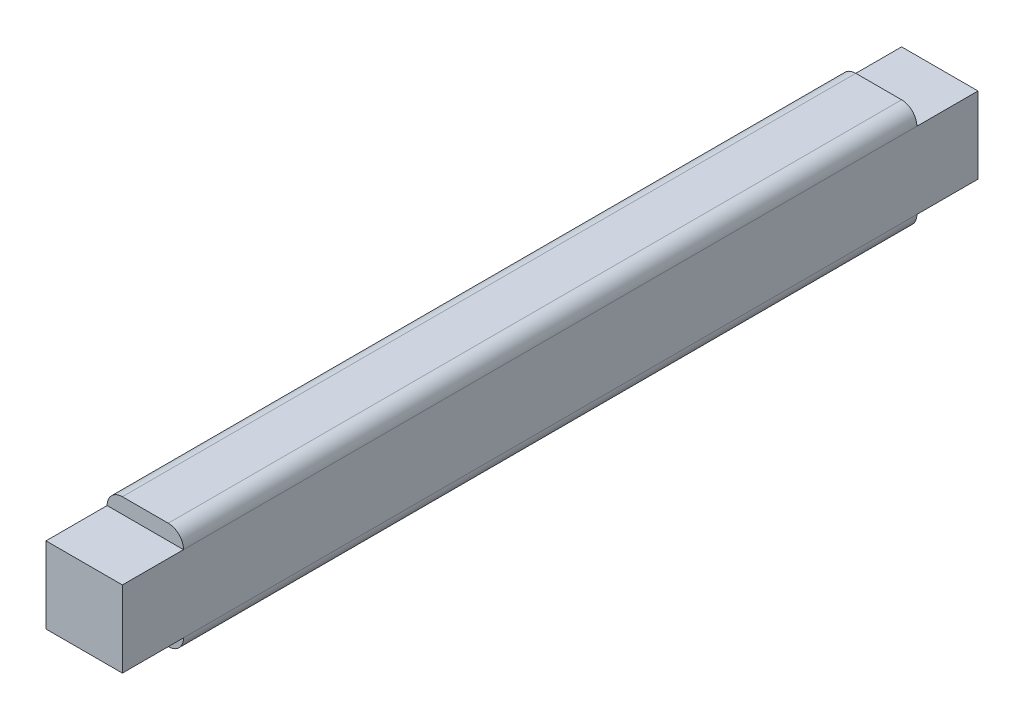
ISO-10303-21;
HEADER;
FILE_DESCRIPTION(('STEP AP214'),'2;1');
FILE_NAME('part.step','',(''),(''),'','','');
FILE_SCHEMA(('AUTOMOTIVE_DESIGN { 1 0 10303 214 1 1 1 1 }'));
ENDSEC;
DATA;
#1=APPLICATION_CONTEXT('core data for automotive mechanical design processes');
#2=APPLICATION_PROTOCOL_DEFINITION('international standard','automotive_design',2000,#1);
#3=PRODUCT_CONTEXT('',#1,'mechanical');
#4=PRODUCT('Part','Part','',(#3));
#5=PRODUCT_RELATED_PRODUCT_CATEGORY('part','',(#4));
#6=PRODUCT_DEFINITION_FORMATION('','',#4);
#7=PRODUCT_DEFINITION_CONTEXT('part definition',#1,'design');
#8=PRODUCT_DEFINITION('design','',#6,#7);
#9=PRODUCT_DEFINITION_SHAPE('','',#8);
#10=(LENGTH_UNIT() NAMED_UNIT(*) SI_UNIT(.MILLI.,.METRE.));
#11=(NAMED_UNIT(*) PLANE_ANGLE_UNIT() SI_UNIT($,.RADIAN.));
#12=(NAMED_UNIT(*) SI_UNIT($,.STERADIAN.) SOLID_ANGLE_UNIT());
#13=UNCERTAINTY_MEASURE_WITH_UNIT(LENGTH_MEASURE(1.E-05),#10,'distance_accuracy_value','');
#14=(GEOMETRIC_REPRESENTATION_CONTEXT(3) GLOBAL_UNCERTAINTY_ASSIGNED_CONTEXT((#13)) GLOBAL_UNIT_ASSIGNED_CONTEXT((#10,
#11,#12)) REPRESENTATION_CONTEXT('',''));
#15=CARTESIAN_POINT('',(0.,0.,0.));
#16=DIRECTION('',(0.,0.,1.));
#17=DIRECTION('',(1.,0.,0.));
#18=AXIS2_PLACEMENT_3D('',#15,#16,#17);
#19=CARTESIAN_POINT('',(0.,0.,0.));
#20=DIRECTION('',(0.,0.,-1.));
#21=DIRECTION('',(-1.,0.,0.));
#22=AXIS2_PLACEMENT_3D('',#19,#20,#21);
#23=PLANE('',#22);
#24=DIRECTION('',(0.,1.,0.));
#25=VECTOR('',#24,1.);
#26=CARTESIAN_POINT('',(25.,0.,0.));
#27=LINE('',#26,#25);
#28=CARTESIAN_POINT('',(25.,5.,0.));
#29=VERTEX_POINT('',#28);
#30=CARTESIAN_POINT('',(25.,30.,0.));
#31=VERTEX_POINT('',#30);
#32=EDGE_CURVE('E204',#29,#31,#27,.T.);
#33=ORIENTED_EDGE('',*,*,#32,.F.);
#34=DIRECTION('',(-1.,0.,0.));
#35=VECTOR('',#34,1.);
#36=CARTESIAN_POINT('',(0.,5.,0.));
#37=LINE('',#36,#35);
#38=CARTESIAN_POINT('',(0.,5.,0.));
#39=VERTEX_POINT('',#38);
#40=EDGE_CURVE('E158',#29,#39,#37,.T.);
#41=ORIENTED_EDGE('',*,*,#40,.T.);
#42=DIRECTION('',(0.,-1.,0.));
#43=VECTOR('',#42,1.);
#44=CARTESIAN_POINT('',(0.,0.,0.));
#45=LINE('',#44,#43);
#46=CARTESIAN_POINT('',(0.,30.,0.));
#47=VERTEX_POINT('',#46);
#48=EDGE_CURVE('E199',#47,#39,#45,.T.);
#49=ORIENTED_EDGE('',*,*,#48,.F.);
#50=DIRECTION('',(1.,0.,0.));
#51=VECTOR('',#50,1.);
#52=CARTESIAN_POINT('',(0.,30.,0.));
#53=LINE('',#52,#51);
#54=EDGE_CURVE('E153',#47,#31,#53,.T.);
#55=ORIENTED_EDGE('',*,*,#54,.T.);
#56=EDGE_LOOP('',(#33,#41,#49,#55));
#57=FACE_BOUND('',#56,.T.);
#58=ADVANCED_FACE('F35',(#57),#23,.T.);
#59=CARTESIAN_POINT('',(0.,0.,280.));
#60=DIRECTION('',(1.,0.,0.));
#61=DIRECTION('',(0.,0.,-1.));
#62=AXIS2_PLACEMENT_3D('',#59,#60,#61);
#63=PLANE('',#62);
#64=DIRECTION('',(0.,0.,-1.));
#65=VECTOR('',#64,1.);
#66=CARTESIAN_POINT('',(0.,5.,20.));
#67=LINE('',#66,#65);
#68=CARTESIAN_POINT('',(0.,5.,20.));
#69=VERTEX_POINT('',#68);
#70=EDGE_CURVE('E166',#69,#39,#67,.T.);
#71=ORIENTED_EDGE('',*,*,#70,.F.);
#72=DIRECTION('',(0.,0.,-1.));
#73=VECTOR('',#72,1.);
#74=CARTESIAN_POINT('',(0.,5.,280.));
#75=LINE('',#74,#73);
#76=CARTESIAN_POINT('',(0.,5.,260.));
#77=VERTEX_POINT('',#76);
#78=EDGE_CURVE('E144',#69,#77,#75,.F.);
#79=ORIENTED_EDGE('',*,*,#78,.T.);
#80=DIRECTION('',(0.,0.,1.));
#81=VECTOR('',#80,1.);
#82=CARTESIAN_POINT('',(0.,5.,260.));
#83=LINE('',#82,#81);
#84=CARTESIAN_POINT('',(0.,5.,280.));
#85=VERTEX_POINT('',#84);
#86=EDGE_CURVE('E191',#77,#85,#83,.T.);
#87=ORIENTED_EDGE('',*,*,#86,.T.);
#88=DIRECTION('',(0.,-1.,0.));
#89=VECTOR('',#88,1.);
#90=CARTESIAN_POINT('',(0.,0.,280.));
#91=LINE('',#90,#89);
#92=CARTESIAN_POINT('',(0.,30.,280.));
#93=VERTEX_POINT('',#92);
#94=EDGE_CURVE('E200',#93,#85,#91,.T.);
#95=ORIENTED_EDGE('',*,*,#94,.F.);
#96=DIRECTION('',(0.,0.,1.));
#97=VECTOR('',#96,1.);
#98=CARTESIAN_POINT('',(0.,30.,260.));
#99=LINE('',#98,#97);
#100=CARTESIAN_POINT('',(0.,30.,260.));
#101=VERTEX_POINT('',#100);
#102=EDGE_CURVE('E143',#101,#93,#99,.T.);
#103=ORIENTED_EDGE('',*,*,#102,.F.);
#104=DIRECTION('',(0.,0.,-1.));
#105=VECTOR('',#104,1.);
#106=CARTESIAN_POINT('',(0.,30.,280.));
#107=LINE('',#106,#105);
#108=CARTESIAN_POINT('',(0.,30.,20.));
#109=VERTEX_POINT('',#108);
#110=EDGE_CURVE('E126',#101,#109,#107,.T.);
#111=ORIENTED_EDGE('',*,*,#110,.T.);
#112=DIRECTION('',(0.,0.,-1.));
#113=VECTOR('',#112,1.);
#114=CARTESIAN_POINT('',(0.,30.,20.));
#115=LINE('',#114,#113);
#116=EDGE_CURVE('E140',#109,#47,#115,.T.);
#117=ORIENTED_EDGE('',*,*,#116,.T.);
#118=ORIENTED_EDGE('',*,*,#48,.T.);
#119=EDGE_LOOP('',(#71,#79,#87,#95,#103,#111,#117,#118));
#120=FACE_BOUND('',#119,.T.);
#121=ADVANCED_FACE('F138',(#120),#63,.F.);
#122=CARTESIAN_POINT('',(0.,0.,280.));
#123=DIRECTION('',(0.,1.,0.));
#124=DIRECTION('',(0.,0.,1.));
#125=AXIS2_PLACEMENT_3D('',#122,#123,#124);
#126=PLANE('',#125);
#127=DIRECTION('',(1.,0.,0.));
#128=VECTOR('',#127,1.);
#129=CARTESIAN_POINT('',(0.,0.,260.));
#130=LINE('',#129,#128);
#131=CARTESIAN_POINT('',(5.,0.,260.));
#132=VERTEX_POINT('',#131);
#133=CARTESIAN_POINT('',(20.,0.,260.));
#134=VERTEX_POINT('',#133);
#135=EDGE_CURVE('E190',#132,#134,#130,.T.);
#136=ORIENTED_EDGE('',*,*,#135,.F.);
#137=DIRECTION('',(0.,0.,-1.));
#138=VECTOR('',#137,1.);
#139=CARTESIAN_POINT('',(5.,0.,280.));
#140=LINE('',#139,#138);
#141=CARTESIAN_POINT('',(5.,0.,20.));
#142=VERTEX_POINT('',#141);
#143=EDGE_CURVE('E216',#132,#142,#140,.T.);
#144=ORIENTED_EDGE('',*,*,#143,.T.);
#145=DIRECTION('',(1.,0.,0.));
#146=VECTOR('',#145,1.);
#147=CARTESIAN_POINT('',(0.,0.,20.));
#148=LINE('',#147,#146);
#149=CARTESIAN_POINT('',(20.,0.,20.));
#150=VERTEX_POINT('',#149);
#151=EDGE_CURVE('E168',#142,#150,#148,.T.);
#152=ORIENTED_EDGE('',*,*,#151,.T.);
#153=DIRECTION('',(0.,0.,-1.));
#154=VECTOR('',#153,1.);
#155=CARTESIAN_POINT('',(20.,0.,280.));
#156=LINE('',#155,#154);
#157=EDGE_CURVE('E214',#150,#134,#156,.F.);
#158=ORIENTED_EDGE('',*,*,#157,.T.);
#159=EDGE_LOOP('',(#136,#144,#152,#158));
#160=FACE_BOUND('',#159,.T.);
#161=ADVANCED_FACE('F260',(#160),#126,.F.);
#162=CARTESIAN_POINT('',(25.,0.,280.));
#163=DIRECTION('',(-1.,0.,0.));
#164=DIRECTION('',(0.,0.,1.));
#165=AXIS2_PLACEMENT_3D('',#162,#163,#164);
#166=PLANE('',#165);
#167=DIRECTION('',(0.,0.,1.));
#168=VECTOR('',#167,1.);
#169=CARTESIAN_POINT('',(25.,5.,260.));
#170=LINE('',#169,#168);
#171=CARTESIAN_POINT('',(25.,5.,260.));
#172=VERTEX_POINT('',#171);
#173=CARTESIAN_POINT('',(25.,5.,280.));
#174=VERTEX_POINT('',#173);
#175=EDGE_CURVE('E188',#172,#174,#170,.T.);
#176=ORIENTED_EDGE('',*,*,#175,.F.);
#177=DIRECTION('',(0.,0.,-1.));
#178=VECTOR('',#177,1.);
#179=CARTESIAN_POINT('',(25.,5.,280.));
#180=LINE('',#179,#178);
#181=CARTESIAN_POINT('',(25.,5.,20.));
#182=VERTEX_POINT('',#181);
#183=EDGE_CURVE('E229',#172,#182,#180,.T.);
#184=ORIENTED_EDGE('',*,*,#183,.T.);
#185=DIRECTION('',(0.,0.,-1.));
#186=VECTOR('',#185,1.);
#187=CARTESIAN_POINT('',(25.,5.,20.));
#188=LINE('',#187,#186);
#189=EDGE_CURVE('E169',#182,#29,#188,.T.);
#190=ORIENTED_EDGE('',*,*,#189,.T.);
#191=ORIENTED_EDGE('',*,*,#32,.T.);
#192=DIRECTION('',(0.,0.,-1.));
#193=VECTOR('',#192,1.);
#194=CARTESIAN_POINT('',(25.,30.,20.));
#195=LINE('',#194,#193);
#196=CARTESIAN_POINT('',(25.,30.,20.));
#197=VERTEX_POINT('',#196);
#198=EDGE_CURVE('E154',#197,#31,#195,.T.);
#199=ORIENTED_EDGE('',*,*,#198,.F.);
#200=DIRECTION('',(0.,0.,-1.));
#201=VECTOR('',#200,1.);
#202=CARTESIAN_POINT('',(25.,30.,280.));
#203=LINE('',#202,#201);
#204=CARTESIAN_POINT('',(25.,30.,260.));
#205=VERTEX_POINT('',#204);
#206=EDGE_CURVE('E227',#197,#205,#203,.F.);
#207=ORIENTED_EDGE('',*,*,#206,.T.);
#208=DIRECTION('',(0.,0.,1.));
#209=VECTOR('',#208,1.);
#210=CARTESIAN_POINT('',(25.,30.,260.));
#211=LINE('',#210,#209);
#212=CARTESIAN_POINT('',(25.,30.,280.));
#213=VERTEX_POINT('',#212);
#214=EDGE_CURVE('E183',#205,#213,#211,.T.);
#215=ORIENTED_EDGE('',*,*,#214,.T.);
#216=DIRECTION('',(0.,1.,0.));
#217=VECTOR('',#216,1.);
#218=CARTESIAN_POINT('',(25.,0.,280.));
#219=LINE('',#218,#217);
#220=EDGE_CURVE('E203',#174,#213,#219,.T.);
#221=ORIENTED_EDGE('',*,*,#220,.F.);
#222=EDGE_LOOP('',(#176,#184,#190,#191,#199,#207,#215,#221));
#223=FACE_BOUND('',#222,.T.);
#224=ADVANCED_FACE('F242',(#223),#166,.F.);
#225=CARTESIAN_POINT('',(0.,35.,280.));
#226=DIRECTION('',(0.,-1.,0.));
#227=DIRECTION('',(0.,0.,-1.));
#228=AXIS2_PLACEMENT_3D('',#225,#226,#227);
#229=PLANE('',#228);
#230=DIRECTION('',(-1.,0.,0.));
#231=VECTOR('',#230,1.);
#232=CARTESIAN_POINT('',(0.,35.,260.));
#233=LINE('',#232,#231);
#234=CARTESIAN_POINT('',(20.,35.,260.));
#235=VERTEX_POINT('',#234);
#236=CARTESIAN_POINT('',(5.,35.,260.));
#237=VERTEX_POINT('',#236);
#238=EDGE_CURVE('E207',#235,#237,#233,.T.);
#239=ORIENTED_EDGE('',*,*,#238,.F.);
#240=DIRECTION('',(0.,0.,-1.));
#241=VECTOR('',#240,1.);
#242=CARTESIAN_POINT('',(20.,35.,280.));
#243=LINE('',#242,#241);
#244=CARTESIAN_POINT('',(20.,35.,20.));
#245=VERTEX_POINT('',#244);
#246=EDGE_CURVE('E131',#235,#245,#243,.T.);
#247=ORIENTED_EDGE('',*,*,#246,.T.);
#248=DIRECTION('',(-1.,0.,0.));
#249=VECTOR('',#248,1.);
#250=CARTESIAN_POINT('',(0.,35.,20.));
#251=LINE('',#250,#249);
#252=CARTESIAN_POINT('',(5.,35.,20.));
#253=VERTEX_POINT('',#252);
#254=EDGE_CURVE('E212',#245,#253,#251,.T.);
#255=ORIENTED_EDGE('',*,*,#254,.T.);
#256=DIRECTION('',(0.,0.,-1.));
#257=VECTOR('',#256,1.);
#258=CARTESIAN_POINT('',(5.,35.,280.));
#259=LINE('',#258,#257);
#260=EDGE_CURVE('E50',#253,#237,#259,.F.);
#261=ORIENTED_EDGE('',*,*,#260,.T.);
#262=EDGE_LOOP('',(#239,#247,#255,#261));
#263=FACE_BOUND('',#262,.T.);
#264=ADVANCED_FACE('F292',(#263),#229,.F.);
#265=CARTESIAN_POINT('',(0.,0.,280.));
#266=DIRECTION('',(0.,0.,-1.));
#267=DIRECTION('',(-1.,0.,0.));
#268=AXIS2_PLACEMENT_3D('',#265,#266,#267);
#269=PLANE('',#268);
#270=DIRECTION('',(1.,0.,0.));
#271=VECTOR('',#270,1.);
#272=CARTESIAN_POINT('',(25.,5.,280.));
#273=LINE('',#272,#271);
#274=EDGE_CURVE('E180',#85,#174,#273,.T.);
#275=ORIENTED_EDGE('',*,*,#274,.T.);
#276=ORIENTED_EDGE('',*,*,#220,.T.);
#277=DIRECTION('',(-1.,0.,0.));
#278=VECTOR('',#277,1.);
#279=CARTESIAN_POINT('',(25.,30.,280.));
#280=LINE('',#279,#278);
#281=EDGE_CURVE('E175',#213,#93,#280,.T.);
#282=ORIENTED_EDGE('',*,*,#281,.T.);
#283=ORIENTED_EDGE('',*,*,#94,.T.);
#284=EDGE_LOOP('',(#275,#276,#282,#283));
#285=FACE_BOUND('',#284,.T.);
#286=ADVANCED_FACE('F245',(#285),#269,.F.);
#287=CARTESIAN_POINT('',(25.,30.,260.));
#288=DIRECTION('',(0.,1.,0.));
#289=DIRECTION('',(0.,0.,1.));
#290=AXIS2_PLACEMENT_3D('',#287,#288,#289);
#291=PLANE('',#290);
#292=ORIENTED_EDGE('',*,*,#281,.F.);
#293=ORIENTED_EDGE('',*,*,#214,.F.);
#294=DIRECTION('',(-1.,0.,0.));
#295=VECTOR('',#294,1.);
#296=CARTESIAN_POINT('',(25.,30.,260.));
#297=LINE('',#296,#295);
#298=EDGE_CURVE('E176',#205,#101,#297,.T.);
#299=ORIENTED_EDGE('',*,*,#298,.T.);
#300=ORIENTED_EDGE('',*,*,#102,.T.);
#301=EDGE_LOOP('',(#292,#293,#299,#300));
#302=FACE_BOUND('',#301,.T.);
#303=ADVANCED_FACE('F238',(#302),#291,.T.);
#304=CARTESIAN_POINT('',(12.5,17.5,260.));
#305=DIRECTION('',(0.,0.,1.));
#306=DIRECTION('',(1.,0.,0.));
#307=AXIS2_PLACEMENT_3D('',#304,#305,#306);
#308=PLANE('',#307);
#309=ORIENTED_EDGE('',*,*,#298,.F.);
#310=CARTESIAN_POINT('',(20.,30.,260.));
#311=DIRECTION('',(0.,0.,1.));
#312=DIRECTION('',(1.,0.,0.));
#313=AXIS2_PLACEMENT_3D('',#310,#311,#312);
#314=CIRCLE('',#313,5.);
#315=EDGE_CURVE('E12',#205,#235,#314,.T.);
#316=ORIENTED_EDGE('',*,*,#315,.T.);
#317=ORIENTED_EDGE('',*,*,#238,.T.);
#318=CARTESIAN_POINT('',(5.,30.,260.));
#319=DIRECTION('',(0.,0.,1.));
#320=DIRECTION('',(1.,0.,0.));
#321=AXIS2_PLACEMENT_3D('',#318,#319,#320);
#322=CIRCLE('',#321,5.);
#323=EDGE_CURVE('E43',#237,#101,#322,.T.);
#324=ORIENTED_EDGE('',*,*,#323,.T.);
#325=EDGE_LOOP('',(#309,#316,#317,#324));
#326=FACE_BOUND('',#325,.T.);
#327=ADVANCED_FACE('F235',(#326),#308,.T.);
#328=DIRECTION('',(1.,0.,0.));
#329=VECTOR('',#328,1.);
#330=CARTESIAN_POINT('',(25.,5.,260.));
#331=LINE('',#330,#329);
#332=EDGE_CURVE('E179',#77,#172,#331,.T.);
#333=ORIENTED_EDGE('',*,*,#332,.F.);
#334=CARTESIAN_POINT('',(5.,5.,260.));
#335=DIRECTION('',(0.,0.,1.));
#336=DIRECTION('',(1.,0.,0.));
#337=AXIS2_PLACEMENT_3D('',#334,#335,#336);
#338=CIRCLE('',#337,5.);
#339=EDGE_CURVE('E225',#77,#132,#338,.T.);
#340=ORIENTED_EDGE('',*,*,#339,.T.);
#341=ORIENTED_EDGE('',*,*,#135,.T.);
#342=CARTESIAN_POINT('',(20.,5.,260.));
#343=DIRECTION('',(0.,0.,1.));
#344=DIRECTION('',(1.,0.,0.));
#345=AXIS2_PLACEMENT_3D('',#342,#343,#344);
#346=CIRCLE('',#345,5.);
#347=EDGE_CURVE('E223',#134,#172,#346,.T.);
#348=ORIENTED_EDGE('',*,*,#347,.T.);
#349=EDGE_LOOP('',(#333,#340,#341,#348));
#350=FACE_BOUND('',#349,.T.);
#351=ADVANCED_FACE('F257',(#350),#308,.T.);
#352=CARTESIAN_POINT('',(25.,5.,260.));
#353=DIRECTION('',(0.,-1.,0.));
#354=DIRECTION('',(0.,0.,-1.));
#355=AXIS2_PLACEMENT_3D('',#352,#353,#354);
#356=PLANE('',#355);
#357=ORIENTED_EDGE('',*,*,#274,.F.);
#358=ORIENTED_EDGE('',*,*,#86,.F.);
#359=ORIENTED_EDGE('',*,*,#332,.T.);
#360=ORIENTED_EDGE('',*,*,#175,.T.);
#361=EDGE_LOOP('',(#357,#358,#359,#360));
#362=FACE_BOUND('',#361,.T.);
#363=ADVANCED_FACE('F248',(#362),#356,.T.);
#364=CARTESIAN_POINT('',(0.,30.,20.));
#365=DIRECTION('',(0.,1.,0.));
#366=DIRECTION('',(0.,0.,1.));
#367=AXIS2_PLACEMENT_3D('',#364,#365,#366);
#368=PLANE('',#367);
#369=ORIENTED_EDGE('',*,*,#54,.F.);
#370=ORIENTED_EDGE('',*,*,#116,.F.);
#371=DIRECTION('',(1.,0.,0.));
#372=VECTOR('',#371,1.);
#373=CARTESIAN_POINT('',(0.,30.,20.));
#374=LINE('',#373,#372);
#375=EDGE_CURVE('E150',#109,#197,#374,.T.);
#376=ORIENTED_EDGE('',*,*,#375,.T.);
#377=ORIENTED_EDGE('',*,*,#198,.T.);
#378=EDGE_LOOP('',(#369,#370,#376,#377));
#379=FACE_BOUND('',#378,.T.);
#380=ADVANCED_FACE('F149',(#379),#368,.T.);
#381=CARTESIAN_POINT('',(0.,0.,20.));
#382=DIRECTION('',(0.,0.,1.));
#383=DIRECTION('',(1.,0.,0.));
#384=AXIS2_PLACEMENT_3D('',#381,#382,#383);
#385=PLANE('',#384);
#386=ORIENTED_EDGE('',*,*,#254,.F.);
#387=CARTESIAN_POINT('',(20.,30.,20.));
#388=DIRECTION('',(0.,0.,1.));
#389=DIRECTION('',(1.,0.,0.));
#390=AXIS2_PLACEMENT_3D('',#387,#388,#389);
#391=CIRCLE('',#390,5.);
#392=EDGE_CURVE('E130',#245,#197,#391,.F.);
#393=ORIENTED_EDGE('',*,*,#392,.T.);
#394=ORIENTED_EDGE('',*,*,#375,.F.);
#395=CARTESIAN_POINT('',(5.,30.,20.));
#396=DIRECTION('',(0.,0.,1.));
#397=DIRECTION('',(1.,0.,0.));
#398=AXIS2_PLACEMENT_3D('',#395,#396,#397);
#399=CIRCLE('',#398,5.);
#400=EDGE_CURVE('E123',#109,#253,#399,.F.);
#401=ORIENTED_EDGE('',*,*,#400,.T.);
#402=EDGE_LOOP('',(#386,#393,#394,#401));
#403=FACE_BOUND('',#402,.T.);
#404=ADVANCED_FACE('F157',(#403),#385,.F.);
#405=ORIENTED_EDGE('',*,*,#151,.F.);
#406=CARTESIAN_POINT('',(5.,5.,20.));
#407=DIRECTION('',(0.,0.,1.));
#408=DIRECTION('',(1.,0.,0.));
#409=AXIS2_PLACEMENT_3D('',#406,#407,#408);
#410=CIRCLE('',#409,5.);
#411=EDGE_CURVE('E145',#142,#69,#410,.F.);
#412=ORIENTED_EDGE('',*,*,#411,.T.);
#413=DIRECTION('',(-1.,0.,0.));
#414=VECTOR('',#413,1.);
#415=CARTESIAN_POINT('',(0.,5.,20.));
#416=LINE('',#415,#414);
#417=EDGE_CURVE('E155',#182,#69,#416,.T.);
#418=ORIENTED_EDGE('',*,*,#417,.F.);
#419=CARTESIAN_POINT('',(20.,5.,20.));
#420=DIRECTION('',(0.,0.,1.));
#421=DIRECTION('',(1.,0.,0.));
#422=AXIS2_PLACEMENT_3D('',#419,#420,#421);
#423=CIRCLE('',#422,5.);
#424=EDGE_CURVE('E219',#182,#150,#423,.F.);
#425=ORIENTED_EDGE('',*,*,#424,.T.);
#426=EDGE_LOOP('',(#405,#412,#418,#425));
#427=FACE_BOUND('',#426,.T.);
#428=ADVANCED_FACE('F272',(#427),#385,.F.);
#429=CARTESIAN_POINT('',(0.,5.,20.));
#430=DIRECTION('',(0.,-1.,0.));
#431=DIRECTION('',(0.,0.,-1.));
#432=AXIS2_PLACEMENT_3D('',#429,#430,#431);
#433=PLANE('',#432);
#434=ORIENTED_EDGE('',*,*,#40,.F.);
#435=ORIENTED_EDGE('',*,*,#189,.F.);
#436=ORIENTED_EDGE('',*,*,#417,.T.);
#437=ORIENTED_EDGE('',*,*,#70,.T.);
#438=EDGE_LOOP('',(#434,#435,#436,#437));
#439=FACE_BOUND('',#438,.T.);
#440=ADVANCED_FACE('F270',(#439),#433,.T.);
#441=CARTESIAN_POINT('',(5.,5.,280.));
#442=DIRECTION('',(0.,0.,-1.));
#443=DIRECTION('',(-1.,0.,0.));
#444=AXIS2_PLACEMENT_3D('',#441,#442,#443);
#445=CYLINDRICAL_SURFACE('',#444,5.);
#446=ORIENTED_EDGE('',*,*,#339,.F.);
#447=ORIENTED_EDGE('',*,*,#78,.F.);
#448=ORIENTED_EDGE('',*,*,#411,.F.);
#449=ORIENTED_EDGE('',*,*,#143,.F.);
#450=EDGE_LOOP('',(#446,#447,#448,#449));
#451=FACE_BOUND('',#450,.T.);
#452=ADVANCED_FACE('F253',(#451),#445,.T.);
#453=CARTESIAN_POINT('',(20.,5.,280.));
#454=DIRECTION('',(0.,0.,-1.));
#455=DIRECTION('',(-1.,0.,0.));
#456=AXIS2_PLACEMENT_3D('',#453,#454,#455);
#457=CYLINDRICAL_SURFACE('',#456,5.);
#458=ORIENTED_EDGE('',*,*,#347,.F.);
#459=ORIENTED_EDGE('',*,*,#157,.F.);
#460=ORIENTED_EDGE('',*,*,#424,.F.);
#461=ORIENTED_EDGE('',*,*,#183,.F.);
#462=EDGE_LOOP('',(#458,#459,#460,#461));
#463=FACE_BOUND('',#462,.T.);
#464=ADVANCED_FACE('F264',(#463),#457,.T.);
#465=CARTESIAN_POINT('',(20.,30.,280.));
#466=DIRECTION('',(0.,0.,-1.));
#467=DIRECTION('',(-1.,0.,0.));
#468=AXIS2_PLACEMENT_3D('',#465,#466,#467);
#469=CYLINDRICAL_SURFACE('',#468,5.);
#470=ORIENTED_EDGE('',*,*,#315,.F.);
#471=ORIENTED_EDGE('',*,*,#206,.F.);
#472=ORIENTED_EDGE('',*,*,#392,.F.);
#473=ORIENTED_EDGE('',*,*,#246,.F.);
#474=EDGE_LOOP('',(#470,#471,#472,#473));
#475=FACE_BOUND('',#474,.T.);
#476=ADVANCED_FACE('F302',(#475),#469,.T.);
#477=CARTESIAN_POINT('',(5.,30.,280.));
#478=DIRECTION('',(0.,0.,-1.));
#479=DIRECTION('',(-1.,0.,0.));
#480=AXIS2_PLACEMENT_3D('',#477,#478,#479);
#481=CYLINDRICAL_SURFACE('',#480,5.);
#482=ORIENTED_EDGE('',*,*,#323,.F.);
#483=ORIENTED_EDGE('',*,*,#260,.F.);
#484=ORIENTED_EDGE('',*,*,#400,.F.);
#485=ORIENTED_EDGE('',*,*,#110,.F.);
#486=EDGE_LOOP('',(#482,#483,#484,#485));
#487=FACE_BOUND('',#486,.T.);
#488=ADVANCED_FACE('F37',(#487),#481,.T.);
#489=CLOSED_SHELL('',(#58,#121,#161,#224,#264,#286,#303,#327,#351,#363,#380,#404,#428,#440,#452,
#464,#476,#488));
#490=MANIFOLD_SOLID_BREP('B2',#489);
#491=ADVANCED_BREP_SHAPE_REPRESENTATION('',(#18,#490),#14);
#492=SHAPE_DEFINITION_REPRESENTATION(#9,#491);
ENDSEC;
END-ISO-10303-21;
